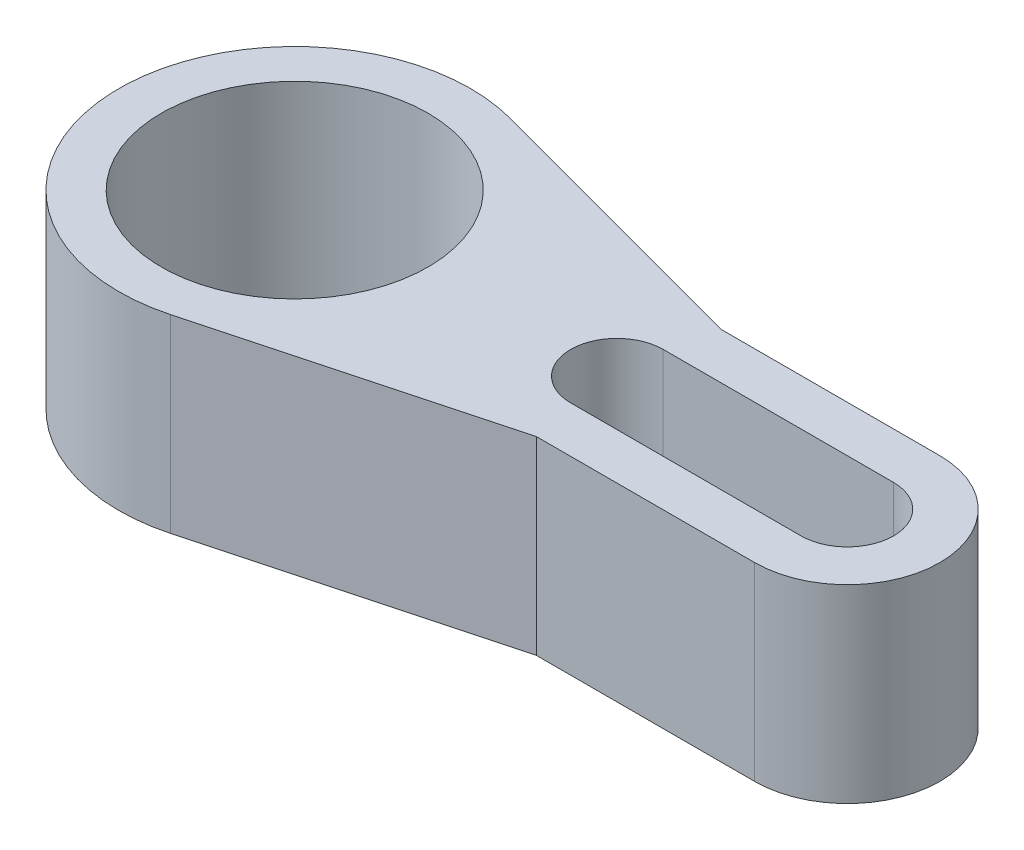
ISO-10303-21;
HEADER;
FILE_DESCRIPTION(('STEP AP214'),'2;1');
FILE_NAME('part.step','',(''),(''),'','','');
FILE_SCHEMA(('AUTOMOTIVE_DESIGN { 1 0 10303 214 1 1 1 1 }'));
ENDSEC;
DATA;
#1=APPLICATION_CONTEXT('core data for automotive mechanical design processes');
#2=APPLICATION_PROTOCOL_DEFINITION('international standard','automotive_design',2000,#1);
#3=PRODUCT_CONTEXT('',#1,'mechanical');
#4=PRODUCT('Part','Part','',(#3));
#5=PRODUCT_RELATED_PRODUCT_CATEGORY('part','',(#4));
#6=PRODUCT_DEFINITION_FORMATION('','',#4);
#7=PRODUCT_DEFINITION_CONTEXT('part definition',#1,'design');
#8=PRODUCT_DEFINITION('design','',#6,#7);
#9=PRODUCT_DEFINITION_SHAPE('','',#8);
#10=(LENGTH_UNIT() NAMED_UNIT(*) SI_UNIT(.MILLI.,.METRE.));
#11=(NAMED_UNIT(*) PLANE_ANGLE_UNIT() SI_UNIT($,.RADIAN.));
#12=(NAMED_UNIT(*) SI_UNIT($,.STERADIAN.) SOLID_ANGLE_UNIT());
#13=UNCERTAINTY_MEASURE_WITH_UNIT(LENGTH_MEASURE(1.E-05),#10,'distance_accuracy_value','');
#14=(GEOMETRIC_REPRESENTATION_CONTEXT(3) GLOBAL_UNCERTAINTY_ASSIGNED_CONTEXT((#13)) GLOBAL_UNIT_ASSIGNED_CONTEXT((#10,
#11,#12)) REPRESENTATION_CONTEXT('',''));
#15=CARTESIAN_POINT('',(0.,0.,0.));
#16=DIRECTION('',(0.,0.,1.));
#17=DIRECTION('',(1.,0.,0.));
#18=AXIS2_PLACEMENT_3D('',#15,#16,#17);
#19=CARTESIAN_POINT('',(0.,13.,-6.35));
#20=DIRECTION('',(0.,0.,-1.));
#21=DIRECTION('',(-1.,0.,0.));
#22=AXIS2_PLACEMENT_3D('',#19,#20,#21);
#23=PLANE('',#22);
#24=DIRECTION('',(1.,0.,0.));
#25=VECTOR('',#24,1.);
#26=CARTESIAN_POINT('',(0.,0.,-6.35));
#27=LINE('',#26,#25);
#28=CARTESIAN_POINT('',(22.9352518340183,0.,-6.35));
#29=VERTEX_POINT('',#28);
#30=CARTESIAN_POINT('',(37.9000000000005,0.,-6.35));
#31=VERTEX_POINT('',#30);
#32=EDGE_CURVE('E182',#29,#31,#27,.T.);
#33=ORIENTED_EDGE('',*,*,#32,.F.);
#34=DIRECTION('',(0.,-1.,0.));
#35=VECTOR('',#34,1.);
#36=CARTESIAN_POINT('',(22.9352518340183,13.,-6.35));
#37=LINE('',#36,#35);
#38=CARTESIAN_POINT('',(22.9352518340183,13.,-6.35));
#39=VERTEX_POINT('',#38);
#40=EDGE_CURVE('E11',#39,#29,#37,.T.);
#41=ORIENTED_EDGE('',*,*,#40,.F.);
#42=DIRECTION('',(1.,0.,0.));
#43=VECTOR('',#42,1.);
#44=CARTESIAN_POINT('',(0.,13.,-6.35));
#45=LINE('',#44,#43);
#46=CARTESIAN_POINT('',(37.9000000000005,13.,-6.35));
#47=VERTEX_POINT('',#46);
#48=EDGE_CURVE('E203',#39,#47,#45,.T.);
#49=ORIENTED_EDGE('',*,*,#48,.T.);
#50=DIRECTION('',(0.,-1.,0.));
#51=VECTOR('',#50,1.);
#52=CARTESIAN_POINT('',(37.9000000000005,13.,-6.35));
#53=LINE('',#52,#51);
#54=EDGE_CURVE('E98',#47,#31,#53,.T.);
#55=ORIENTED_EDGE('',*,*,#54,.T.);
#56=EDGE_LOOP('',(#33,#41,#49,#55));
#57=FACE_BOUND('',#56,.T.);
#58=ADVANCED_FACE('F39',(#57),#23,.T.);
#59=CARTESIAN_POINT('',(3.11997624434389,13.,-11.6546116724123));
#60=DIRECTION('',(0.258597285067873,0.,-0.96598521942912));
#61=DIRECTION('',(-0.96598521942912,0.,-0.258597285067873));
#62=AXIS2_PLACEMENT_3D('',#59,#60,#61);
#63=PLANE('',#62);
#64=DIRECTION('',(0.96598521942912,0.,0.258597285067873));
#65=VECTOR('',#64,1.);
#66=CARTESIAN_POINT('',(3.11997624434389,0.,-11.6546116724123));
#67=LINE('',#66,#65);
#68=CARTESIAN_POINT('',(3.11997624434389,0.,-11.6546116724123));
#69=VERTEX_POINT('',#68);
#70=EDGE_CURVE('E179',#69,#29,#67,.T.);
#71=ORIENTED_EDGE('',*,*,#70,.F.);
#72=DIRECTION('',(0.,-1.,0.));
#73=VECTOR('',#72,1.);
#74=CARTESIAN_POINT('',(3.11997624434389,13.,-11.6546116724123));
#75=LINE('',#74,#73);
#76=CARTESIAN_POINT('',(3.11997624434389,13.,-11.6546116724123));
#77=VERTEX_POINT('',#76);
#78=EDGE_CURVE('E49',#77,#69,#75,.T.);
#79=ORIENTED_EDGE('',*,*,#78,.F.);
#80=DIRECTION('',(0.96598521942912,0.,0.258597285067873));
#81=VECTOR('',#80,1.);
#82=CARTESIAN_POINT('',(3.11997624434389,13.,-11.6546116724123));
#83=LINE('',#82,#81);
#84=EDGE_CURVE('E200',#77,#39,#83,.T.);
#85=ORIENTED_EDGE('',*,*,#84,.T.);
#86=ORIENTED_EDGE('',*,*,#40,.T.);
#87=EDGE_LOOP('',(#71,#79,#85,#86));
#88=FACE_BOUND('',#87,.T.);
#89=ADVANCED_FACE('F238',(#88),#63,.T.);
#90=CARTESIAN_POINT('',(0.,13.,0.));
#91=DIRECTION('',(0.,-1.,0.));
#92=DIRECTION('',(0.,0.,-1.));
#93=AXIS2_PLACEMENT_3D('',#90,#91,#92);
#94=CYLINDRICAL_SURFACE('',#93,12.065);
#95=CARTESIAN_POINT('',(0.,0.,0.));
#96=DIRECTION('',(0.,1.,0.));
#97=DIRECTION('',(0.,0.,1.));
#98=AXIS2_PLACEMENT_3D('',#95,#96,#97);
#99=CIRCLE('',#98,12.065);
#100=CARTESIAN_POINT('',(3.11997624434389,0.,11.6546116724123));
#101=VERTEX_POINT('',#100);
#102=EDGE_CURVE('E176',#69,#101,#99,.T.);
#103=ORIENTED_EDGE('',*,*,#102,.T.);
#104=DIRECTION('',(0.,-1.,0.));
#105=VECTOR('',#104,1.);
#106=CARTESIAN_POINT('',(3.11997624434389,13.,11.6546116724123));
#107=LINE('',#106,#105);
#108=CARTESIAN_POINT('',(3.11997624434389,13.,11.6546116724123));
#109=VERTEX_POINT('',#108);
#110=EDGE_CURVE('E149',#109,#101,#107,.T.);
#111=ORIENTED_EDGE('',*,*,#110,.F.);
#112=CARTESIAN_POINT('',(0.,13.,0.));
#113=DIRECTION('',(0.,1.,0.));
#114=DIRECTION('',(0.,0.,1.));
#115=AXIS2_PLACEMENT_3D('',#112,#113,#114);
#116=CIRCLE('',#115,12.065);
#117=EDGE_CURVE('E142',#77,#109,#116,.T.);
#118=ORIENTED_EDGE('',*,*,#117,.F.);
#119=ORIENTED_EDGE('',*,*,#78,.T.);
#120=EDGE_LOOP('',(#103,#111,#118,#119));
#121=FACE_BOUND('',#120,.T.);
#122=ADVANCED_FACE('F242',(#121),#94,.T.);
#123=CARTESIAN_POINT('',(3.11997624434389,13.,11.6546116724123));
#124=DIRECTION('',(-0.258597285067873,0.,-0.96598521942912));
#125=DIRECTION('',(-0.96598521942912,0.,0.258597285067873));
#126=AXIS2_PLACEMENT_3D('',#123,#124,#125);
#127=PLANE('',#126);
#128=DIRECTION('',(0.96598521942912,0.,-0.258597285067873));
#129=VECTOR('',#128,1.);
#130=CARTESIAN_POINT('',(3.11997624434389,0.,11.6546116724123));
#131=LINE('',#130,#129);
#132=CARTESIAN_POINT('',(22.9352518340183,0.,6.35));
#133=VERTEX_POINT('',#132);
#134=EDGE_CURVE('E148',#101,#133,#131,.T.);
#135=ORIENTED_EDGE('',*,*,#134,.T.);
#136=DIRECTION('',(0.,-1.,0.));
#137=VECTOR('',#136,1.);
#138=CARTESIAN_POINT('',(22.9352518340183,13.,6.35));
#139=LINE('',#138,#137);
#140=CARTESIAN_POINT('',(22.9352518340183,13.,6.35));
#141=VERTEX_POINT('',#140);
#142=EDGE_CURVE('E132',#141,#133,#139,.T.);
#143=ORIENTED_EDGE('',*,*,#142,.F.);
#144=DIRECTION('',(0.96598521942912,0.,-0.258597285067873));
#145=VECTOR('',#144,1.);
#146=CARTESIAN_POINT('',(3.11997624434389,13.,11.6546116724123));
#147=LINE('',#146,#145);
#148=EDGE_CURVE('E135',#109,#141,#147,.T.);
#149=ORIENTED_EDGE('',*,*,#148,.F.);
#150=ORIENTED_EDGE('',*,*,#110,.T.);
#151=EDGE_LOOP('',(#135,#143,#149,#150));
#152=FACE_BOUND('',#151,.T.);
#153=ADVANCED_FACE('F147',(#152),#127,.F.);
#154=CARTESIAN_POINT('',(0.,13.,6.35));
#155=DIRECTION('',(0.,0.,-1.));
#156=DIRECTION('',(-1.,0.,0.));
#157=AXIS2_PLACEMENT_3D('',#154,#155,#156);
#158=PLANE('',#157);
#159=DIRECTION('',(1.,0.,0.));
#160=VECTOR('',#159,1.);
#161=CARTESIAN_POINT('',(0.,0.,6.35));
#162=LINE('',#161,#160);
#163=CARTESIAN_POINT('',(37.9000000000005,0.,6.35));
#164=VERTEX_POINT('',#163);
#165=EDGE_CURVE('E173',#133,#164,#162,.T.);
#166=ORIENTED_EDGE('',*,*,#165,.T.);
#167=DIRECTION('',(0.,-1.,0.));
#168=VECTOR('',#167,1.);
#169=CARTESIAN_POINT('',(37.9000000000005,13.,6.35));
#170=LINE('',#169,#168);
#171=CARTESIAN_POINT('',(37.9000000000005,13.,6.35));
#172=VERTEX_POINT('',#171);
#173=EDGE_CURVE('E134',#172,#164,#170,.T.);
#174=ORIENTED_EDGE('',*,*,#173,.F.);
#175=DIRECTION('',(1.,0.,0.));
#176=VECTOR('',#175,1.);
#177=CARTESIAN_POINT('',(0.,13.,6.35));
#178=LINE('',#177,#176);
#179=EDGE_CURVE('E127',#141,#172,#178,.T.);
#180=ORIENTED_EDGE('',*,*,#179,.F.);
#181=ORIENTED_EDGE('',*,*,#142,.T.);
#182=EDGE_LOOP('',(#166,#174,#180,#181));
#183=FACE_BOUND('',#182,.T.);
#184=ADVANCED_FACE('F130',(#183),#158,.F.);
#185=CARTESIAN_POINT('',(37.9000000000005,13.,0.));
#186=DIRECTION('',(0.,-1.,0.));
#187=DIRECTION('',(0.,0.,-1.));
#188=AXIS2_PLACEMENT_3D('',#185,#186,#187);
#189=CYLINDRICAL_SURFACE('',#188,3.175);
#190=CARTESIAN_POINT('',(37.9000000000005,0.,0.));
#191=DIRECTION('',(0.,1.,0.));
#192=DIRECTION('',(0.,0.,1.));
#193=AXIS2_PLACEMENT_3D('',#190,#191,#192);
#194=CIRCLE('',#193,3.175);
#195=CARTESIAN_POINT('',(37.9000000000005,0.,3.175));
#196=VERTEX_POINT('',#195);
#197=CARTESIAN_POINT('',(37.9000000000005,0.,-3.175));
#198=VERTEX_POINT('',#197);
#199=EDGE_CURVE('E193',#196,#198,#194,.T.);
#200=ORIENTED_EDGE('',*,*,#199,.F.);
#201=DIRECTION('',(0.,-1.,0.));
#202=VECTOR('',#201,1.);
#203=CARTESIAN_POINT('',(37.9000000000005,13.,3.175));
#204=LINE('',#203,#202);
#205=CARTESIAN_POINT('',(37.9000000000005,13.,3.175));
#206=VERTEX_POINT('',#205);
#207=EDGE_CURVE('E43',#206,#196,#204,.T.);
#208=ORIENTED_EDGE('',*,*,#207,.F.);
#209=CARTESIAN_POINT('',(37.9000000000005,13.,0.));
#210=DIRECTION('',(0.,1.,0.));
#211=DIRECTION('',(0.,0.,1.));
#212=AXIS2_PLACEMENT_3D('',#209,#210,#211);
#213=CIRCLE('',#212,3.175);
#214=CARTESIAN_POINT('',(37.9000000000005,13.,-3.175));
#215=VERTEX_POINT('',#214);
#216=EDGE_CURVE('E171',#206,#215,#213,.T.);
#217=ORIENTED_EDGE('',*,*,#216,.T.);
#218=DIRECTION('',(0.,-1.,0.));
#219=VECTOR('',#218,1.);
#220=CARTESIAN_POINT('',(37.9000000000005,13.,-3.175));
#221=LINE('',#220,#219);
#222=EDGE_CURVE('E156',#215,#198,#221,.T.);
#223=ORIENTED_EDGE('',*,*,#222,.T.);
#224=EDGE_LOOP('',(#200,#208,#217,#223));
#225=FACE_BOUND('',#224,.T.);
#226=ADVANCED_FACE('F41',(#225),#189,.F.);
#227=CARTESIAN_POINT('',(0.,13.,3.175));
#228=DIRECTION('',(0.,0.,-1.));
#229=DIRECTION('',(-1.,0.,0.));
#230=AXIS2_PLACEMENT_3D('',#227,#228,#229);
#231=PLANE('',#230);
#232=DIRECTION('',(1.,0.,0.));
#233=VECTOR('',#232,1.);
#234=CARTESIAN_POINT('',(0.,0.,3.175));
#235=LINE('',#234,#233);
#236=CARTESIAN_POINT('',(22.1,0.,3.175));
#237=VERTEX_POINT('',#236);
#238=EDGE_CURVE('E190',#237,#196,#235,.T.);
#239=ORIENTED_EDGE('',*,*,#238,.F.);
#240=DIRECTION('',(0.,-1.,0.));
#241=VECTOR('',#240,1.);
#242=CARTESIAN_POINT('',(22.1,13.,3.175));
#243=LINE('',#242,#241);
#244=CARTESIAN_POINT('',(22.1,13.,3.175));
#245=VERTEX_POINT('',#244);
#246=EDGE_CURVE('E160',#245,#237,#243,.T.);
#247=ORIENTED_EDGE('',*,*,#246,.F.);
#248=DIRECTION('',(1.,0.,0.));
#249=VECTOR('',#248,1.);
#250=CARTESIAN_POINT('',(0.,13.,3.175));
#251=LINE('',#250,#249);
#252=EDGE_CURVE('E209',#245,#206,#251,.T.);
#253=ORIENTED_EDGE('',*,*,#252,.T.);
#254=ORIENTED_EDGE('',*,*,#207,.T.);
#255=EDGE_LOOP('',(#239,#247,#253,#254));
#256=FACE_BOUND('',#255,.T.);
#257=ADVANCED_FACE('F216',(#256),#231,.T.);
#258=CARTESIAN_POINT('',(22.1,13.,0.));
#259=DIRECTION('',(0.,-1.,0.));
#260=DIRECTION('',(0.,0.,-1.));
#261=AXIS2_PLACEMENT_3D('',#258,#259,#260);
#262=CYLINDRICAL_SURFACE('',#261,3.175);
#263=CARTESIAN_POINT('',(22.1,0.,0.));
#264=DIRECTION('',(0.,1.,0.));
#265=DIRECTION('',(0.,0.,1.));
#266=AXIS2_PLACEMENT_3D('',#263,#264,#265);
#267=CIRCLE('',#266,3.175);
#268=CARTESIAN_POINT('',(22.1,0.,-3.175));
#269=VERTEX_POINT('',#268);
#270=EDGE_CURVE('E187',#269,#237,#267,.T.);
#271=ORIENTED_EDGE('',*,*,#270,.F.);
#272=DIRECTION('',(0.,-1.,0.));
#273=VECTOR('',#272,1.);
#274=CARTESIAN_POINT('',(22.1,13.,-3.175));
#275=LINE('',#274,#273);
#276=CARTESIAN_POINT('',(22.1,13.,-3.175));
#277=VERTEX_POINT('',#276);
#278=EDGE_CURVE('E158',#277,#269,#275,.T.);
#279=ORIENTED_EDGE('',*,*,#278,.F.);
#280=CARTESIAN_POINT('',(22.1,13.,0.));
#281=DIRECTION('',(0.,1.,0.));
#282=DIRECTION('',(0.,0.,1.));
#283=AXIS2_PLACEMENT_3D('',#280,#281,#282);
#284=CIRCLE('',#283,3.175);
#285=EDGE_CURVE('E207',#277,#245,#284,.T.);
#286=ORIENTED_EDGE('',*,*,#285,.T.);
#287=ORIENTED_EDGE('',*,*,#246,.T.);
#288=EDGE_LOOP('',(#271,#279,#286,#287));
#289=FACE_BOUND('',#288,.T.);
#290=ADVANCED_FACE('F220',(#289),#262,.F.);
#291=CARTESIAN_POINT('',(37.9000000000005,13.,0.));
#292=DIRECTION('',(0.,-1.,0.));
#293=DIRECTION('',(0.,0.,-1.));
#294=AXIS2_PLACEMENT_3D('',#291,#292,#293);
#295=CYLINDRICAL_SURFACE('',#294,6.35);
#296=CARTESIAN_POINT('',(37.9000000000005,0.,0.));
#297=DIRECTION('',(0.,1.,0.));
#298=DIRECTION('',(0.,0.,1.));
#299=AXIS2_PLACEMENT_3D('',#296,#297,#298);
#300=CIRCLE('',#299,6.35);
#301=EDGE_CURVE('E91',#164,#31,#300,.T.);
#302=ORIENTED_EDGE('',*,*,#301,.T.);
#303=ORIENTED_EDGE('',*,*,#54,.F.);
#304=CARTESIAN_POINT('',(37.9000000000005,13.,0.));
#305=DIRECTION('',(0.,1.,0.));
#306=DIRECTION('',(0.,0.,1.));
#307=AXIS2_PLACEMENT_3D('',#304,#305,#306);
#308=CIRCLE('',#307,6.35);
#309=EDGE_CURVE('E58',#172,#47,#308,.T.);
#310=ORIENTED_EDGE('',*,*,#309,.F.);
#311=ORIENTED_EDGE('',*,*,#173,.T.);
#312=EDGE_LOOP('',(#302,#303,#310,#311));
#313=FACE_BOUND('',#312,.T.);
#314=ADVANCED_FACE('F225',(#313),#295,.T.);
#315=CARTESIAN_POINT('',(0.,13.,-3.175));
#316=DIRECTION('',(0.,0.,-1.));
#317=DIRECTION('',(-1.,0.,0.));
#318=AXIS2_PLACEMENT_3D('',#315,#316,#317);
#319=PLANE('',#318);
#320=DIRECTION('',(1.,0.,0.));
#321=VECTOR('',#320,1.);
#322=CARTESIAN_POINT('',(0.,0.,-3.175));
#323=LINE('',#322,#321);
#324=EDGE_CURVE('E184',#269,#198,#323,.T.);
#325=ORIENTED_EDGE('',*,*,#324,.T.);
#326=ORIENTED_EDGE('',*,*,#222,.F.);
#327=DIRECTION('',(1.,0.,0.));
#328=VECTOR('',#327,1.);
#329=CARTESIAN_POINT('',(0.,13.,-3.175));
#330=LINE('',#329,#328);
#331=EDGE_CURVE('E205',#277,#215,#330,.T.);
#332=ORIENTED_EDGE('',*,*,#331,.F.);
#333=ORIENTED_EDGE('',*,*,#278,.T.);
#334=EDGE_LOOP('',(#325,#326,#332,#333));
#335=FACE_BOUND('',#334,.T.);
#336=ADVANCED_FACE('F222',(#335),#319,.F.);
#337=CARTESIAN_POINT('',(0.,13.,0.));
#338=DIRECTION('',(0.,-1.,0.));
#339=DIRECTION('',(0.,0.,-1.));
#340=AXIS2_PLACEMENT_3D('',#337,#338,#339);
#341=CYLINDRICAL_SURFACE('',#340,9.145);
#342=CARTESIAN_POINT('',(0.,13.,0.));
#343=DIRECTION('',(0.,1.,0.));
#344=DIRECTION('',(0.,0.,1.));
#345=AXIS2_PLACEMENT_3D('',#342,#343,#344);
#346=CIRCLE('',#345,9.145);
#347=CARTESIAN_POINT('',(0.,13.,-9.145));
#348=VERTEX_POINT('',#347);
#349=EDGE_CURVE('E159',#348,#348,#346,.T.);
#350=CARTESIAN_POINT('',(0.,0.,0.));
#351=DIRECTION('',(0.,1.,0.));
#352=DIRECTION('',(0.,0.,1.));
#353=AXIS2_PLACEMENT_3D('',#350,#351,#352);
#354=CIRCLE('',#353,9.145);
#355=CARTESIAN_POINT('',(0.,0.,-9.145));
#356=VERTEX_POINT('',#355);
#357=EDGE_CURVE('E168',#356,#356,#354,.T.);
#358=CARTESIAN_POINT('',(0.,13.,-9.145));
#359=CARTESIAN_POINT('',(0.,12.8645833333333,-9.145));
#360=CARTESIAN_POINT('',(0.,12.7291666666667,-9.145));
#361=CARTESIAN_POINT('',(0.,12.4583333333333,-9.145));
#362=CARTESIAN_POINT('',(0.,12.3229166666667,-9.145));
#363=CARTESIAN_POINT('',(0.,12.0520833333333,-9.145));
#364=CARTESIAN_POINT('',(0.,11.9166666666667,-9.145));
#365=CARTESIAN_POINT('',(0.,11.6458333333333,-9.145));
#366=CARTESIAN_POINT('',(0.,11.5104166666667,-9.145));
#367=CARTESIAN_POINT('',(0.,11.2395833333333,-9.145));
#368=CARTESIAN_POINT('',(0.,11.1041666666667,-9.145));
#369=CARTESIAN_POINT('',(0.,10.8333333333333,-9.145));
#370=CARTESIAN_POINT('',(0.,10.6979166666667,-9.145));
#371=CARTESIAN_POINT('',(0.,10.4270833333333,-9.145));
#372=CARTESIAN_POINT('',(0.,10.2916666666667,-9.145));
#373=CARTESIAN_POINT('',(0.,10.0208333333333,-9.145));
#374=CARTESIAN_POINT('',(0.,9.88541666666667,-9.145));
#375=CARTESIAN_POINT('',(0.,9.61458333333333,-9.145));
#376=CARTESIAN_POINT('',(0.,9.47916666666667,-9.145));
#377=CARTESIAN_POINT('',(0.,9.20833333333333,-9.145));
#378=CARTESIAN_POINT('',(0.,9.07291666666667,-9.145));
#379=CARTESIAN_POINT('',(0.,8.80208333333333,-9.145));
#380=CARTESIAN_POINT('',(0.,8.66666666666667,-9.145));
#381=CARTESIAN_POINT('',(0.,8.39583333333333,-9.145));
#382=CARTESIAN_POINT('',(0.,8.26041666666667,-9.145));
#383=CARTESIAN_POINT('',(0.,7.98958333333333,-9.145));
#384=CARTESIAN_POINT('',(0.,7.85416666666667,-9.145));
#385=CARTESIAN_POINT('',(0.,7.58333333333333,-9.145));
#386=CARTESIAN_POINT('',(0.,7.44791666666667,-9.145));
#387=CARTESIAN_POINT('',(0.,7.17708333333333,-9.145));
#388=CARTESIAN_POINT('',(0.,7.04166666666667,-9.145));
#389=CARTESIAN_POINT('',(0.,6.77083333333333,-9.145));
#390=CARTESIAN_POINT('',(0.,6.63541666666667,-9.145));
#391=CARTESIAN_POINT('',(0.,6.36458333333333,-9.145));
#392=CARTESIAN_POINT('',(0.,6.22916666666667,-9.145));
#393=CARTESIAN_POINT('',(0.,5.95833333333333,-9.145));
#394=CARTESIAN_POINT('',(0.,5.82291666666667,-9.145));
#395=CARTESIAN_POINT('',(0.,5.55208333333333,-9.145));
#396=CARTESIAN_POINT('',(0.,5.41666666666667,-9.145));
#397=CARTESIAN_POINT('',(0.,5.14583333333333,-9.145));
#398=CARTESIAN_POINT('',(0.,5.01041666666667,-9.145));
#399=CARTESIAN_POINT('',(0.,4.73958333333333,-9.145));
#400=CARTESIAN_POINT('',(0.,4.60416666666667,-9.145));
#401=CARTESIAN_POINT('',(0.,4.33333333333333,-9.145));
#402=CARTESIAN_POINT('',(0.,4.19791666666667,-9.145));
#403=CARTESIAN_POINT('',(0.,3.92708333333333,-9.145));
#404=CARTESIAN_POINT('',(0.,3.79166666666667,-9.145));
#405=CARTESIAN_POINT('',(0.,3.52083333333333,-9.145));
#406=CARTESIAN_POINT('',(0.,3.38541666666667,-9.145));
#407=CARTESIAN_POINT('',(0.,3.11458333333333,-9.145));
#408=CARTESIAN_POINT('',(0.,2.97916666666667,-9.145));
#409=CARTESIAN_POINT('',(0.,2.70833333333333,-9.145));
#410=CARTESIAN_POINT('',(0.,2.57291666666667,-9.145));
#411=CARTESIAN_POINT('',(0.,2.30208333333333,-9.145));
#412=CARTESIAN_POINT('',(0.,2.16666666666667,-9.145));
#413=CARTESIAN_POINT('',(0.,1.89583333333333,-9.145));
#414=CARTESIAN_POINT('',(0.,1.76041666666667,-9.145));
#415=CARTESIAN_POINT('',(0.,1.48958333333333,-9.145));
#416=CARTESIAN_POINT('',(0.,1.35416666666667,-9.145));
#417=CARTESIAN_POINT('',(0.,1.08333333333333,-9.145));
#418=CARTESIAN_POINT('',(0.,0.947916666666667,-9.145));
#419=CARTESIAN_POINT('',(0.,0.677083333333334,-9.145));
#420=CARTESIAN_POINT('',(0.,0.541666666666667,-9.145));
#421=CARTESIAN_POINT('',(0.,0.270833333333334,-9.145));
#422=CARTESIAN_POINT('',(0.,0.135416666666667,-9.145));
#423=CARTESIAN_POINT('',(0.,0.,-9.145));
#424=B_SPLINE_CURVE_WITH_KNOTS('',3,(#358,#359,#360,#361,#362,#363,#364,#365,#366,#367,#368,
#369,#370,#371,#372,#373,#374,#375,#376,#377,#378,#379,#380,#381,#382,#383,#384,#385,#386,#387,
#388,#389,#390,#391,#392,#393,#394,#395,#396,#397,#398,#399,#400,#401,#402,#403,#404,#405,#406,
#407,#408,#409,#410,#411,#412,#413,#414,#415,#416,#417,#418,#419,#420,#421,#422,#423),
.UNSPECIFIED.,.F.,.F.,(4,2,2,2,2,2,2,2,2,2,2,2,2,2,2,2,2,2,2,2,2,2,2,2,2,2,2,2,2,2,2,2,4),(0.,
0.406249999999999,0.812499999999999,1.21875,1.625,2.03125,2.4375,2.84375,3.25,3.65625,4.0625,
4.46875,4.875,5.28125,5.6875,6.09375,6.5,6.90625,7.3125,7.71875,8.125,8.53125,8.9375,9.34375,
9.75,10.15625,10.5625,10.96875,11.375,11.78125,12.1875,12.59375,13.),.UNSPECIFIED.);
#425=EDGE_CURVE('BSEAM224',#348,#356,#424,.T.);
#426=ORIENTED_EDGE('',*,*,#349,.T.);
#427=ORIENTED_EDGE('',*,*,#357,.F.);
#428=ORIENTED_EDGE('',*,*,#425,.T.);
#429=ORIENTED_EDGE('',*,*,#425,.F.);
#430=EDGE_LOOP('',(#426,#428,#427,#429));
#431=FACE_BOUND('',#430,.T.);
#432=ADVANCED_FACE('F224',(#431),#341,.F.);
#433=CARTESIAN_POINT('',(0.,13.,0.));
#434=DIRECTION('',(0.,1.,0.));
#435=DIRECTION('',(0.,0.,1.));
#436=AXIS2_PLACEMENT_3D('',#433,#434,#435);
#437=PLANE('',#436);
#438=ORIENTED_EDGE('',*,*,#216,.F.);
#439=ORIENTED_EDGE('',*,*,#252,.F.);
#440=ORIENTED_EDGE('',*,*,#285,.F.);
#441=ORIENTED_EDGE('',*,*,#331,.T.);
#442=EDGE_LOOP('',(#438,#439,#440,#441));
#443=FACE_BOUND('',#442,.T.);
#444=ORIENTED_EDGE('',*,*,#48,.F.);
#445=ORIENTED_EDGE('',*,*,#84,.F.);
#446=ORIENTED_EDGE('',*,*,#117,.T.);
#447=ORIENTED_EDGE('',*,*,#148,.T.);
#448=ORIENTED_EDGE('',*,*,#179,.T.);
#449=ORIENTED_EDGE('',*,*,#309,.T.);
#450=EDGE_LOOP('',(#444,#445,#446,#447,#448,#449));
#451=FACE_BOUND('',#450,.T.);
#452=ORIENTED_EDGE('',*,*,#349,.F.);
#453=EDGE_LOOP('',(#452));
#454=FACE_BOUND('',#453,.T.);
#455=ADVANCED_FACE('F138',(#443,#451,#454),#437,.T.);
#456=CARTESIAN_POINT('',(0.,0.,0.));
#457=DIRECTION('',(0.,1.,0.));
#458=DIRECTION('',(0.,0.,1.));
#459=AXIS2_PLACEMENT_3D('',#456,#457,#458);
#460=PLANE('',#459);
#461=ORIENTED_EDGE('',*,*,#199,.T.);
#462=ORIENTED_EDGE('',*,*,#324,.F.);
#463=ORIENTED_EDGE('',*,*,#270,.T.);
#464=ORIENTED_EDGE('',*,*,#238,.T.);
#465=EDGE_LOOP('',(#461,#462,#463,#464));
#466=FACE_BOUND('',#465,.T.);
#467=ORIENTED_EDGE('',*,*,#32,.T.);
#468=ORIENTED_EDGE('',*,*,#301,.F.);
#469=ORIENTED_EDGE('',*,*,#165,.F.);
#470=ORIENTED_EDGE('',*,*,#134,.F.);
#471=ORIENTED_EDGE('',*,*,#102,.F.);
#472=ORIENTED_EDGE('',*,*,#70,.T.);
#473=EDGE_LOOP('',(#467,#468,#469,#470,#471,#472));
#474=FACE_BOUND('',#473,.T.);
#475=ORIENTED_EDGE('',*,*,#357,.T.);
#476=EDGE_LOOP('',(#475));
#477=FACE_BOUND('',#476,.T.);
#478=ADVANCED_FACE('F219',(#466,#474,#477),#460,.F.);
#479=CLOSED_SHELL('',(#58,#89,#122,#153,#184,#226,#257,#290,#314,#336,#432,#455,#478));
#480=MANIFOLD_SOLID_BREP('B2',#479);
#481=ADVANCED_BREP_SHAPE_REPRESENTATION('',(#18,#480),#14);
#482=SHAPE_DEFINITION_REPRESENTATION(#9,#481);
ENDSEC;
END-ISO-10303-21;
